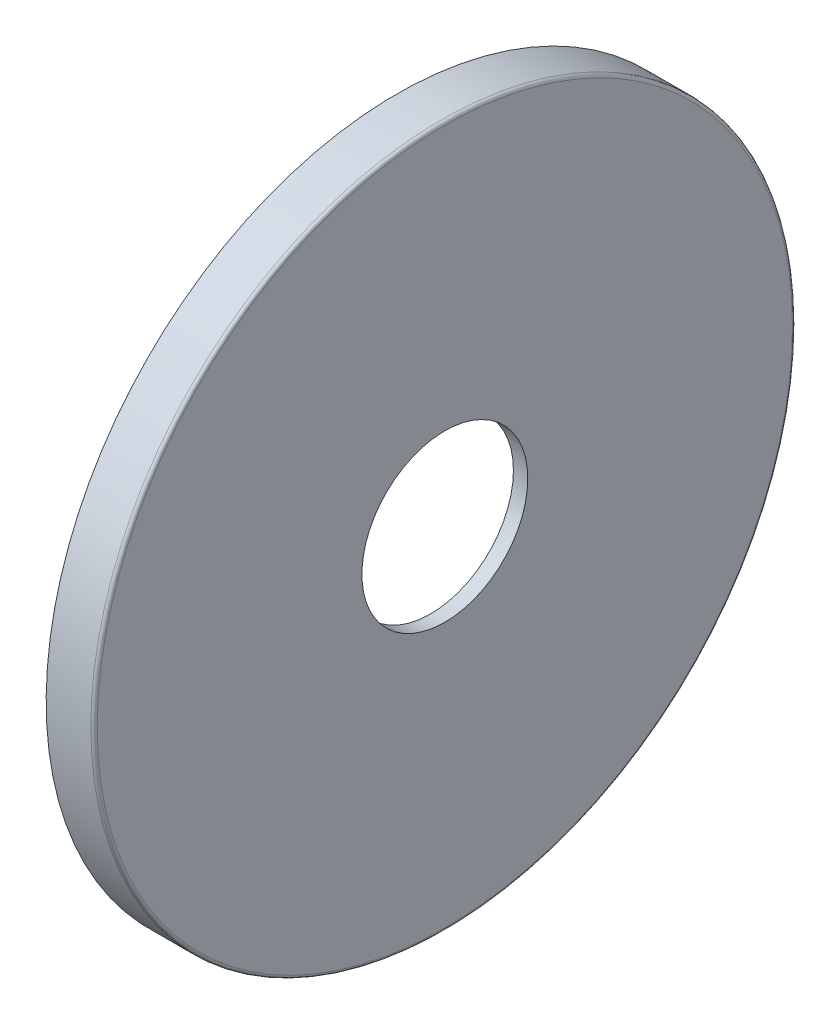
ISO-10303-21;
HEADER;
FILE_DESCRIPTION(('STEP AP214'),'2;1');
FILE_NAME('part.step','',(''),(''),'','','');
FILE_SCHEMA(('AUTOMOTIVE_DESIGN { 1 0 10303 214 1 1 1 1 }'));
ENDSEC;
DATA;
#1=APPLICATION_CONTEXT('core data for automotive mechanical design processes');
#2=APPLICATION_PROTOCOL_DEFINITION('international standard','automotive_design',2000,#1);
#3=PRODUCT_CONTEXT('',#1,'mechanical');
#4=PRODUCT('Part','Part','',(#3));
#5=PRODUCT_RELATED_PRODUCT_CATEGORY('part','',(#4));
#6=PRODUCT_DEFINITION_FORMATION('','',#4);
#7=PRODUCT_DEFINITION_CONTEXT('part definition',#1,'design');
#8=PRODUCT_DEFINITION('design','',#6,#7);
#9=PRODUCT_DEFINITION_SHAPE('','',#8);
#10=(LENGTH_UNIT() NAMED_UNIT(*) SI_UNIT(.MILLI.,.METRE.));
#11=(NAMED_UNIT(*) PLANE_ANGLE_UNIT() SI_UNIT($,.RADIAN.));
#12=(NAMED_UNIT(*) SI_UNIT($,.STERADIAN.) SOLID_ANGLE_UNIT());
#13=UNCERTAINTY_MEASURE_WITH_UNIT(LENGTH_MEASURE(1.E-05),#10,'distance_accuracy_value','');
#14=(GEOMETRIC_REPRESENTATION_CONTEXT(3) GLOBAL_UNCERTAINTY_ASSIGNED_CONTEXT((#13)) GLOBAL_UNIT_ASSIGNED_CONTEXT((#10,
#11,#12)) REPRESENTATION_CONTEXT('',''));
#15=CARTESIAN_POINT('',(0.,0.,0.));
#16=DIRECTION('',(0.,0.,1.));
#17=DIRECTION('',(1.,0.,0.));
#18=AXIS2_PLACEMENT_3D('',#15,#16,#17);
#19=CARTESIAN_POINT('',(67.,-33.3856048886515,-25.));
#20=DIRECTION('',(1.,0.,0.));
#21=DIRECTION('',(0.,0.,-1.));
#22=AXIS2_PLACEMENT_3D('',#19,#20,#21);
#23=PLANE('',#22);
#24=CARTESIAN_POINT('',(67.,0.,0.));
#25=DIRECTION('',(1.,0.,0.));
#26=DIRECTION('',(0.,0.,-1.));
#27=AXIS2_PLACEMENT_3D('',#24,#25,#26);
#28=CIRCLE('',#27,21.1);
#29=CARTESIAN_POINT('',(67.,-21.0049994049036,2.));
#30=VERTEX_POINT('',#29);
#31=CARTESIAN_POINT('',(67.,21.0049994049036,2.00000000000033));
#32=VERTEX_POINT('',#31);
#33=EDGE_CURVE('E221',#30,#32,#28,.F.);
#34=ORIENTED_EDGE('',*,*,#33,.F.);
#35=DIRECTION('',(0.,-1.,0.));
#36=VECTOR('',#35,1.);
#37=CARTESIAN_POINT('',(67.,-21.0049994049036,2.));
#38=LINE('',#37,#36);
#39=CARTESIAN_POINT('',(67.,-20.4049994049036,2.00000000000017));
#40=VERTEX_POINT('',#39);
#41=EDGE_CURVE('E189',#40,#30,#38,.T.);
#42=ORIENTED_EDGE('',*,*,#41,.F.);
#43=CARTESIAN_POINT('',(67.,0.6,0.));
#44=DIRECTION('',(-1.,0.,0.));
#45=DIRECTION('',(0.,0.,1.));
#46=AXIS2_PLACEMENT_3D('',#43,#44,#45);
#47=CIRCLE('',#46,21.1);
#48=CARTESIAN_POINT('',(67.,-20.4049994049036,-2.00000000000004));
#49=VERTEX_POINT('',#48);
#50=EDGE_CURVE('E181',#49,#40,#47,.T.);
#51=ORIENTED_EDGE('',*,*,#50,.F.);
#52=DIRECTION('',(0.,-1.,0.));
#53=VECTOR('',#52,1.);
#54=CARTESIAN_POINT('',(67.,-21.0049994049036,-2.00000000000005));
#55=LINE('',#54,#53);
#56=CARTESIAN_POINT('',(67.,-21.0049994049036,-2.00000000000005));
#57=VERTEX_POINT('',#56);
#58=EDGE_CURVE('E193',#49,#57,#55,.T.);
#59=ORIENTED_EDGE('',*,*,#58,.T.);
#60=CARTESIAN_POINT('',(67.,21.0049994049036,-2.00000000000005));
#61=VERTEX_POINT('',#60);
#62=EDGE_CURVE('E226',#61,#57,#28,.F.);
#63=ORIENTED_EDGE('',*,*,#62,.F.);
#64=DIRECTION('',(0.,1.,0.));
#65=VECTOR('',#64,1.);
#66=CARTESIAN_POINT('',(67.,21.0049994049036,-2.00000000000005));
#67=LINE('',#66,#65);
#68=CARTESIAN_POINT('',(67.,20.4049994049036,-2.00000000000005));
#69=VERTEX_POINT('',#68);
#70=EDGE_CURVE('E200',#69,#61,#67,.T.);
#71=ORIENTED_EDGE('',*,*,#70,.F.);
#72=CARTESIAN_POINT('',(67.,-0.6,0.));
#73=DIRECTION('',(1.,0.,0.));
#74=DIRECTION('',(0.,0.,-1.));
#75=AXIS2_PLACEMENT_3D('',#72,#73,#74);
#76=CIRCLE('',#75,21.1);
#77=CARTESIAN_POINT('',(67.,20.4049994049036,2.00000000000033));
#78=VERTEX_POINT('',#77);
#79=EDGE_CURVE('E196',#69,#78,#76,.T.);
#80=ORIENTED_EDGE('',*,*,#79,.T.);
#81=DIRECTION('',(0.,1.,0.));
#82=VECTOR('',#81,1.);
#83=CARTESIAN_POINT('',(67.,21.0049994049036,2.00000000000033));
#84=LINE('',#83,#82);
#85=EDGE_CURVE('E206',#78,#32,#84,.T.);
#86=ORIENTED_EDGE('',*,*,#85,.T.);
#87=EDGE_LOOP('',(#34,#42,#51,#59,#63,#71,#80,#86));
#88=FACE_BOUND('',#87,.T.);
#89=DIRECTION('',(0.,-1.,0.));
#90=VECTOR('',#89,1.);
#91=CARTESIAN_POINT('',(67.,-21.1246301742776,4.));
#92=LINE('',#91,#90);
#93=CARTESIAN_POINT('',(67.,-21.1246301742776,4.));
#94=VERTEX_POINT('',#93);
#95=CARTESIAN_POINT('',(67.,-21.3915871313935,4.));
#96=VERTEX_POINT('',#95);
#97=EDGE_CURVE('E177',#94,#96,#92,.T.);
#98=ORIENTED_EDGE('',*,*,#97,.T.);
#99=CARTESIAN_POINT('',(67.,-21.3915871313935,4.2));
#100=DIRECTION('',(1.,0.,0.));
#101=DIRECTION('',(0.,0.,-1.));
#102=AXIS2_PLACEMENT_3D('',#99,#100,#101);
#103=CIRCLE('',#102,0.2);
#104=CARTESIAN_POINT('',(67.,-21.5878402243421,4.23853211009174));
#105=VERTEX_POINT('',#104);
#106=EDGE_CURVE('E326',#96,#105,#103,.F.);
#107=ORIENTED_EDGE('',*,*,#106,.T.);
#108=CARTESIAN_POINT('',(67.,0.,0.));
#109=DIRECTION('',(1.,0.,0.));
#110=DIRECTION('',(0.,0.,-1.));
#111=AXIS2_PLACEMENT_3D('',#108,#109,#110);
#112=CIRCLE('',#111,22.);
#113=CARTESIAN_POINT('',(67.,-21.5878402243421,-4.23853211009174));
#114=VERTEX_POINT('',#113);
#115=EDGE_CURVE('E225',#105,#114,#112,.F.);
#116=ORIENTED_EDGE('',*,*,#115,.T.);
#117=CARTESIAN_POINT('',(67.,-21.3915871313935,-4.2));
#118=DIRECTION('',(1.,0.,0.));
#119=DIRECTION('',(0.,0.,-1.));
#120=AXIS2_PLACEMENT_3D('',#117,#118,#119);
#121=CIRCLE('',#120,0.2);
#122=CARTESIAN_POINT('',(67.,-21.3915871313935,-4.));
#123=VERTEX_POINT('',#122);
#124=EDGE_CURVE('E336',#114,#123,#121,.F.);
#125=ORIENTED_EDGE('',*,*,#124,.T.);
#126=DIRECTION('',(0.,1.,0.));
#127=VECTOR('',#126,1.);
#128=CARTESIAN_POINT('',(67.,-23.5456760368751,-4.));
#129=LINE('',#128,#127);
#130=CARTESIAN_POINT('',(67.,-21.1246301742776,-4.));
#131=VERTEX_POINT('',#130);
#132=EDGE_CURVE('E173',#123,#131,#129,.T.);
#133=ORIENTED_EDGE('',*,*,#132,.T.);
#134=CARTESIAN_POINT('',(67.,0.,0.));
#135=DIRECTION('',(-1.,0.,0.));
#136=DIRECTION('',(0.,0.,-1.));
#137=AXIS2_PLACEMENT_3D('',#134,#135,#136);
#138=CIRCLE('',#137,21.5);
#139=EDGE_CURVE('E328',#131,#94,#138,.T.);
#140=ORIENTED_EDGE('',*,*,#139,.T.);
#141=EDGE_LOOP('',(#98,#107,#116,#125,#133,#140));
#142=FACE_BOUND('',#141,.T.);
#143=ADVANCED_FACE('F36',(#88,#142),#23,.F.);
#144=CARTESIAN_POINT('',(-20.,0.,0.));
#145=DIRECTION('',(1.,0.,0.));
#146=DIRECTION('',(0.,0.,-1.));
#147=AXIS2_PLACEMENT_3D('',#144,#145,#146);
#148=CYLINDRICAL_SURFACE('',#147,22.);
#149=CARTESIAN_POINT('',(69.8,0.,0.));
#150=DIRECTION('',(1.,0.,0.));
#151=DIRECTION('',(0.,0.,-1.));
#152=AXIS2_PLACEMENT_3D('',#149,#150,#151);
#153=CIRCLE('',#152,22.);
#154=CARTESIAN_POINT('',(69.8,0.,-22.));
#155=VERTEX_POINT('',#154);
#156=EDGE_CURVE('E234',#155,#155,#153,.F.);
#157=ORIENTED_EDGE('',*,*,#156,.T.);
#158=EDGE_LOOP('',(#157));
#159=FACE_BOUND('',#158,.T.);
#160=ORIENTED_EDGE('',*,*,#115,.F.);
#161=DIRECTION('',(1.,0.,0.));
#162=VECTOR('',#161,1.);
#163=CARTESIAN_POINT('',(-20.,-21.5878402243421,4.23853211009174));
#164=LINE('',#163,#162);
#165=CARTESIAN_POINT('',(67.8,-21.5878402243421,4.23853211009174));
#166=VERTEX_POINT('',#165);
#167=EDGE_CURVE('E335',#105,#166,#164,.T.);
#168=ORIENTED_EDGE('',*,*,#167,.T.);
#169=CARTESIAN_POINT('',(67.8,0.,0.));
#170=DIRECTION('',(1.,0.,0.));
#171=DIRECTION('',(0.,0.,-1.));
#172=AXIS2_PLACEMENT_3D('',#169,#170,#171);
#173=CIRCLE('',#172,22.);
#174=CARTESIAN_POINT('',(67.8,-21.5878402243421,-4.23853211009174));
#175=VERTEX_POINT('',#174);
#176=EDGE_CURVE('E362',#166,#175,#173,.T.);
#177=ORIENTED_EDGE('',*,*,#176,.T.);
#178=DIRECTION('',(1.,0.,0.));
#179=VECTOR('',#178,1.);
#180=CARTESIAN_POINT('',(-20.,-21.5878402243421,-4.23853211009174));
#181=LINE('',#180,#179);
#182=EDGE_CURVE('E295',#175,#114,#181,.F.);
#183=ORIENTED_EDGE('',*,*,#182,.T.);
#184=EDGE_LOOP('',(#160,#168,#177,#183));
#185=FACE_BOUND('',#184,.T.);
#186=ADVANCED_FACE('F310',(#159,#185),#148,.T.);
#187=CARTESIAN_POINT('',(-20.,0.,0.));
#188=DIRECTION('',(1.,0.,0.));
#189=DIRECTION('',(0.,0.,-1.));
#190=AXIS2_PLACEMENT_3D('',#187,#188,#189);
#191=CYLINDRICAL_SURFACE('',#190,21.1);
#192=CARTESIAN_POINT('',(69.1,0.,0.));
#193=DIRECTION('',(1.,0.,0.));
#194=DIRECTION('',(0.,0.,-1.));
#195=AXIS2_PLACEMENT_3D('',#192,#193,#194);
#196=CIRCLE('',#195,21.1);
#197=CARTESIAN_POINT('',(69.1,0.,-21.1));
#198=VERTEX_POINT('',#197);
#199=EDGE_CURVE('E222',#198,#198,#196,.T.);
#200=ORIENTED_EDGE('',*,*,#199,.T.);
#201=EDGE_LOOP('',(#200));
#202=FACE_BOUND('',#201,.T.);
#203=DIRECTION('',(1.,0.,0.));
#204=VECTOR('',#203,1.);
#205=CARTESIAN_POINT('',(-20.,-21.0049994049036,2.00000000000033));
#206=LINE('',#205,#204);
#207=CARTESIAN_POINT('',(67.7413560551055,-21.0049994049036,2.00000000000033));
#208=VERTEX_POINT('',#207);
#209=EDGE_CURVE('E249',#30,#208,#206,.T.);
#210=ORIENTED_EDGE('',*,*,#209,.F.);
#211=ORIENTED_EDGE('',*,*,#33,.T.);
#212=DIRECTION('',(1.,0.,0.));
#213=VECTOR('',#212,1.);
#214=CARTESIAN_POINT('',(-20.,21.0049994049036,2.00000000000033));
#215=LINE('',#214,#213);
#216=CARTESIAN_POINT('',(67.8,21.0049994049036,2.00000000000033));
#217=VERTEX_POINT('',#216);
#218=EDGE_CURVE('E243',#32,#217,#215,.T.);
#219=ORIENTED_EDGE('',*,*,#218,.T.);
#220=CARTESIAN_POINT('',(67.8,0.,0.));
#221=DIRECTION('',(1.,0.,0.));
#222=DIRECTION('',(0.,0.,-1.));
#223=AXIS2_PLACEMENT_3D('',#220,#221,#222);
#224=CIRCLE('',#223,21.1);
#225=CARTESIAN_POINT('',(67.8,21.0049994049036,-2.00000000000005));
#226=VERTEX_POINT('',#225);
#227=EDGE_CURVE('E240',#217,#226,#224,.F.);
#228=ORIENTED_EDGE('',*,*,#227,.T.);
#229=DIRECTION('',(1.,0.,0.));
#230=VECTOR('',#229,1.);
#231=CARTESIAN_POINT('',(-20.,21.0049994049036,-2.00000000000005));
#232=LINE('',#231,#230);
#233=EDGE_CURVE('E237',#61,#226,#232,.T.);
#234=ORIENTED_EDGE('',*,*,#233,.F.);
#235=ORIENTED_EDGE('',*,*,#62,.T.);
#236=DIRECTION('',(1.,0.,0.));
#237=VECTOR('',#236,1.);
#238=CARTESIAN_POINT('',(-20.,-21.0049994049036,-2.00000000000005));
#239=LINE('',#238,#237);
#240=CARTESIAN_POINT('',(67.7413560551055,-21.0049994049036,-2.00000000000005));
#241=VERTEX_POINT('',#240);
#242=EDGE_CURVE('E246',#57,#241,#239,.T.);
#243=ORIENTED_EDGE('',*,*,#242,.T.);
#244=CARTESIAN_POINT('',(67.7413560551055,-21.0049994049036,-2.00000000000005));
#245=CARTESIAN_POINT('',(67.7418567212597,-21.0366840430386,-1.66729499912158));
#246=CARTESIAN_POINT('',(67.7422322748471,-21.0604520184213,-1.33383659012421));
#247=CARTESIAN_POINT('',(67.7427322042752,-21.0920921903696,-0.666917660865427));
#248=CARTESIAN_POINT('',(67.7428571428571,-21.1,-0.333458830432725));
#249=CARTESIAN_POINT('',(67.7428571428571,-21.1,0.333458830432734));
#250=CARTESIAN_POINT('',(67.7427322042752,-21.0920921903696,0.666917660865491));
#251=CARTESIAN_POINT('',(67.7422322748471,-21.0604520184213,1.33383659012439));
#252=CARTESIAN_POINT('',(67.7418567212597,-21.0366840430386,1.66729499912181));
#253=CARTESIAN_POINT('',(67.7413560551055,-21.0049994049036,2.00000000000033));
#254=B_SPLINE_CURVE_WITH_KNOTS('',3,(#244,#245,#246,#247,#248,#249,#250,#251,#252,#253),
.UNSPECIFIED.,.F.,.F.,(4,2,2,2,4),(0.,1.00253668389604,2.00281969925344,3.00310271461101,
4.00563939850722),.UNSPECIFIED.);
#255=EDGE_CURVE('E287',#241,#208,#254,.T.);
#256=ORIENTED_EDGE('',*,*,#255,.T.);
#257=EDGE_LOOP('',(#210,#211,#219,#228,#234,#235,#243,#256));
#258=FACE_BOUND('',#257,.T.);
#259=ADVANCED_FACE('F304',(#202,#258),#191,.F.);
#260=CARTESIAN_POINT('',(70.,0.,0.));
#261=DIRECTION('',(1.,0.,0.));
#262=DIRECTION('',(0.,0.,-1.));
#263=AXIS2_PLACEMENT_3D('',#260,#261,#262);
#264=PLANE('',#263);
#265=CARTESIAN_POINT('',(70.,0.,0.));
#266=DIRECTION('',(1.,0.,0.));
#267=DIRECTION('',(0.,0.,-1.));
#268=AXIS2_PLACEMENT_3D('',#265,#266,#267);
#269=CIRCLE('',#268,5.2);
#270=CARTESIAN_POINT('',(70.,0.,-5.2));
#271=VERTEX_POINT('',#270);
#272=EDGE_CURVE('E213',#271,#271,#269,.T.);
#273=ORIENTED_EDGE('',*,*,#272,.F.);
#274=EDGE_LOOP('',(#273));
#275=FACE_BOUND('',#274,.T.);
#276=CARTESIAN_POINT('',(70.,0.,0.));
#277=DIRECTION('',(1.,0.,0.));
#278=DIRECTION('',(0.,0.,-1.));
#279=AXIS2_PLACEMENT_3D('',#276,#277,#278);
#280=CIRCLE('',#279,21.8);
#281=CARTESIAN_POINT('',(70.,0.,-21.8));
#282=VERTEX_POINT('',#281);
#283=EDGE_CURVE('E231',#282,#282,#280,.T.);
#284=ORIENTED_EDGE('',*,*,#283,.T.);
#285=EDGE_LOOP('',(#284));
#286=FACE_BOUND('',#285,.T.);
#287=ADVANCED_FACE('F309',(#275,#286),#264,.T.);
#288=CARTESIAN_POINT('',(69.8,0.,0.));
#289=DIRECTION('',(1.,0.,0.));
#290=DIRECTION('',(0.,0.,-1.));
#291=AXIS2_PLACEMENT_3D('',#288,#289,#290);
#292=TOROIDAL_SURFACE('',#291,21.8,0.2);
#293=ORIENTED_EDGE('',*,*,#156,.F.);
#294=EDGE_LOOP('',(#293));
#295=FACE_BOUND('',#294,.T.);
#296=ORIENTED_EDGE('',*,*,#283,.F.);
#297=EDGE_LOOP('',(#296));
#298=FACE_BOUND('',#297,.T.);
#299=ADVANCED_FACE('F281',(#295,#298),#292,.T.);
#300=CARTESIAN_POINT('',(69.1,0.,0.));
#301=DIRECTION('',(1.,0.,0.));
#302=DIRECTION('',(0.,0.,-1.));
#303=AXIS2_PLACEMENT_3D('',#300,#301,#302);
#304=PLANE('',#303);
#305=CARTESIAN_POINT('',(69.1,0.,0.));
#306=DIRECTION('',(1.,0.,0.));
#307=DIRECTION('',(0.,0.,-1.));
#308=AXIS2_PLACEMENT_3D('',#305,#306,#307);
#309=CIRCLE('',#308,5.2);
#310=CARTESIAN_POINT('',(69.1,0.,-5.2));
#311=VERTEX_POINT('',#310);
#312=EDGE_CURVE('E218',#311,#311,#309,.F.);
#313=ORIENTED_EDGE('',*,*,#312,.F.);
#314=EDGE_LOOP('',(#313));
#315=FACE_BOUND('',#314,.T.);
#316=ORIENTED_EDGE('',*,*,#199,.F.);
#317=EDGE_LOOP('',(#316));
#318=FACE_BOUND('',#317,.T.);
#319=ADVANCED_FACE('F312',(#315,#318),#304,.F.);
#320=CARTESIAN_POINT('',(-20.001,0.,0.));
#321=DIRECTION('',(1.,0.,0.));
#322=DIRECTION('',(0.,0.,-1.));
#323=AXIS2_PLACEMENT_3D('',#320,#321,#322);
#324=CYLINDRICAL_SURFACE('',#323,5.2);
#325=CARTESIAN_POINT('',(70.,0.,-5.2));
#326=CARTESIAN_POINT('',(69.990625,0.,-5.2));
#327=CARTESIAN_POINT('',(69.98125,0.,-5.2));
#328=CARTESIAN_POINT('',(69.9625,0.,-5.2));
#329=CARTESIAN_POINT('',(69.953125,0.,-5.2));
#330=CARTESIAN_POINT('',(69.934375,0.,-5.2));
#331=CARTESIAN_POINT('',(69.925,0.,-5.2));
#332=CARTESIAN_POINT('',(69.90625,0.,-5.2));
#333=CARTESIAN_POINT('',(69.896875,0.,-5.2));
#334=CARTESIAN_POINT('',(69.878125,0.,-5.2));
#335=CARTESIAN_POINT('',(69.86875,0.,-5.2));
#336=CARTESIAN_POINT('',(69.85,0.,-5.2));
#337=CARTESIAN_POINT('',(69.840625,0.,-5.2));
#338=CARTESIAN_POINT('',(69.821875,0.,-5.2));
#339=CARTESIAN_POINT('',(69.8125,0.,-5.2));
#340=CARTESIAN_POINT('',(69.79375,0.,-5.2));
#341=CARTESIAN_POINT('',(69.784375,0.,-5.2));
#342=CARTESIAN_POINT('',(69.765625,0.,-5.2));
#343=CARTESIAN_POINT('',(69.75625,0.,-5.2));
#344=CARTESIAN_POINT('',(69.7375,0.,-5.2));
#345=CARTESIAN_POINT('',(69.728125,0.,-5.2));
#346=CARTESIAN_POINT('',(69.709375,0.,-5.2));
#347=CARTESIAN_POINT('',(69.7,0.,-5.2));
#348=CARTESIAN_POINT('',(69.68125,0.,-5.2));
#349=CARTESIAN_POINT('',(69.671875,0.,-5.2));
#350=CARTESIAN_POINT('',(69.653125,0.,-5.2));
#351=CARTESIAN_POINT('',(69.64375,0.,-5.2));
#352=CARTESIAN_POINT('',(69.625,0.,-5.2));
#353=CARTESIAN_POINT('',(69.615625,0.,-5.2));
#354=CARTESIAN_POINT('',(69.596875,0.,-5.2));
#355=CARTESIAN_POINT('',(69.5875,0.,-5.2));
#356=CARTESIAN_POINT('',(69.56875,0.,-5.2));
#357=CARTESIAN_POINT('',(69.559375,0.,-5.2));
#358=CARTESIAN_POINT('',(69.540625,0.,-5.2));
#359=CARTESIAN_POINT('',(69.53125,0.,-5.2));
#360=CARTESIAN_POINT('',(69.5125,0.,-5.2));
#361=CARTESIAN_POINT('',(69.503125,0.,-5.2));
#362=CARTESIAN_POINT('',(69.484375,0.,-5.2));
#363=CARTESIAN_POINT('',(69.475,0.,-5.2));
#364=CARTESIAN_POINT('',(69.45625,0.,-5.2));
#365=CARTESIAN_POINT('',(69.446875,0.,-5.2));
#366=CARTESIAN_POINT('',(69.428125,0.,-5.2));
#367=CARTESIAN_POINT('',(69.41875,0.,-5.2));
#368=CARTESIAN_POINT('',(69.4,0.,-5.2));
#369=CARTESIAN_POINT('',(69.390625,0.,-5.2));
#370=CARTESIAN_POINT('',(69.371875,0.,-5.2));
#371=CARTESIAN_POINT('',(69.3625,0.,-5.2));
#372=CARTESIAN_POINT('',(69.34375,0.,-5.2));
#373=CARTESIAN_POINT('',(69.334375,0.,-5.2));
#374=CARTESIAN_POINT('',(69.315625,0.,-5.2));
#375=CARTESIAN_POINT('',(69.30625,0.,-5.2));
#376=CARTESIAN_POINT('',(69.2875,0.,-5.2));
#377=CARTESIAN_POINT('',(69.278125,0.,-5.2));
#378=CARTESIAN_POINT('',(69.259375,0.,-5.2));
#379=CARTESIAN_POINT('',(69.25,0.,-5.2));
#380=CARTESIAN_POINT('',(69.23125,0.,-5.2));
#381=CARTESIAN_POINT('',(69.221875,0.,-5.2));
#382=CARTESIAN_POINT('',(69.203125,0.,-5.2));
#383=CARTESIAN_POINT('',(69.19375,0.,-5.2));
#384=CARTESIAN_POINT('',(69.175,0.,-5.2));
#385=CARTESIAN_POINT('',(69.165625,0.,-5.2));
#386=CARTESIAN_POINT('',(69.146875,0.,-5.2));
#387=CARTESIAN_POINT('',(69.1375,0.,-5.2));
#388=CARTESIAN_POINT('',(69.11875,0.,-5.2));
#389=CARTESIAN_POINT('',(69.109375,0.,-5.2));
#390=CARTESIAN_POINT('',(69.1,0.,-5.2));
#391=B_SPLINE_CURVE_WITH_KNOTS('',3,(#325,#326,#327,#328,#329,#330,#331,#332,#333,#334,#335,
#336,#337,#338,#339,#340,#341,#342,#343,#344,#345,#346,#347,#348,#349,#350,#351,#352,#353,#354,
#355,#356,#357,#358,#359,#360,#361,#362,#363,#364,#365,#366,#367,#368,#369,#370,#371,#372,#373,
#374,#375,#376,#377,#378,#379,#380,#381,#382,#383,#384,#385,#386,#387,#388,#389,#390),
.UNSPECIFIED.,.F.,.F.,(4,2,2,2,2,2,2,2,2,2,2,2,2,2,2,2,2,2,2,2,2,2,2,2,2,2,2,2,2,2,2,2,4),(0.,
0.0281250000000038,0.0562500000000077,0.0843749999999976,0.112500000000001,0.140625000000005,
0.168749999999995,0.196874999999999,0.225000000000003,0.253125000000007,0.281250000000011,
0.309375000000001,0.337500000000004,0.365625000000008,0.393749999999998,0.421875000000002,
0.450000000000006,0.47812500000001,0.506250000000014,0.534375000000004,0.562500000000007,
0.590625000000011,0.618750000000001,0.646875000000005,0.675000000000009,0.703125000000013,
0.731250000000017,0.759375000000007,0.78750000000001,0.815625000000014,0.843750000000004,
0.871875000000008,0.900000000000012),.UNSPECIFIED.);
#392=EDGE_CURVE('BSEAM424',#271,#311,#391,.T.);
#393=ORIENTED_EDGE('',*,*,#272,.T.);
#394=ORIENTED_EDGE('',*,*,#312,.T.);
#395=ORIENTED_EDGE('',*,*,#392,.T.);
#396=ORIENTED_EDGE('',*,*,#392,.F.);
#397=EDGE_LOOP('',(#393,#395,#394,#396));
#398=FACE_BOUND('',#397,.T.);
#399=ADVANCED_FACE('F424',(#398),#324,.F.);
#400=CARTESIAN_POINT('',(-20.,21.0049994049036,2.00000000000033));
#401=DIRECTION('',(0.,0.,1.));
#402=DIRECTION('',(1.,0.,0.));
#403=AXIS2_PLACEMENT_3D('',#400,#401,#402);
#404=PLANE('',#403);
#405=DIRECTION('',(1.,0.,0.));
#406=VECTOR('',#405,1.);
#407=CARTESIAN_POINT('',(-20.,20.4049994049036,2.00000000000033));
#408=LINE('',#407,#406);
#409=CARTESIAN_POINT('',(67.1,20.4049994049036,2.00000000000033));
#410=VERTEX_POINT('',#409);
#411=EDGE_CURVE('E201',#78,#410,#408,.T.);
#412=ORIENTED_EDGE('',*,*,#411,.T.);
#413=CARTESIAN_POINT('',(67.1,20.4049994049036,2.00000000000033));
#414=CARTESIAN_POINT('',(67.2166642518409,20.4719661494614,2.00000000000033));
#415=CARTESIAN_POINT('',(67.3333297110948,20.5389307903824,2.00000000000033));
#416=CARTESIAN_POINT('',(67.5666630444281,20.6728558649505,2.00000000000033));
#417=CARTESIAN_POINT('',(67.6833309185075,20.7398162985974,2.00000000000033));
#418=CARTESIAN_POINT('',(67.8,20.8067746286076,2.00000000000033));
#419=B_SPLINE_CURVE_WITH_KNOTS('',3,(#413,#414,#415,#416,#417,#418),.UNSPECIFIED.,.F.,.F.,(4,2,
4),(0.,0.403554002147862,0.807108004293259),.UNSPECIFIED.);
#420=CARTESIAN_POINT('',(67.8,20.8067746286076,2.00000000000033));
#421=VERTEX_POINT('',#420);
#422=EDGE_CURVE('E296',#410,#421,#419,.T.);
#423=ORIENTED_EDGE('',*,*,#422,.T.);
#424=DIRECTION('',(0.,1.,0.));
#425=VECTOR('',#424,1.);
#426=CARTESIAN_POINT('',(67.8,21.0049994049036,2.00000000000033));
#427=LINE('',#426,#425);
#428=EDGE_CURVE('E209',#421,#217,#427,.T.);
#429=ORIENTED_EDGE('',*,*,#428,.T.);
#430=ORIENTED_EDGE('',*,*,#218,.F.);
#431=ORIENTED_EDGE('',*,*,#85,.F.);
#432=EDGE_LOOP('',(#412,#423,#429,#430,#431));
#433=FACE_BOUND('',#432,.T.);
#434=ADVANCED_FACE('F426',(#433),#404,.T.);
#435=CARTESIAN_POINT('',(67.8,21.0049994049036,-2.00000000000005));
#436=DIRECTION('',(1.,0.,0.));
#437=DIRECTION('',(0.,0.,-1.));
#438=AXIS2_PLACEMENT_3D('',#435,#436,#437);
#439=PLANE('',#438);
#440=ORIENTED_EDGE('',*,*,#428,.F.);
#441=CARTESIAN_POINT('',(67.8,-0.6,0.));
#442=DIRECTION('',(1.,0.,0.));
#443=DIRECTION('',(0.,0.,-1.));
#444=AXIS2_PLACEMENT_3D('',#441,#442,#443);
#445=CIRCLE('',#444,21.5);
#446=CARTESIAN_POINT('',(67.8,20.8067746286076,-2.00000000000005));
#447=VERTEX_POINT('',#446);
#448=EDGE_CURVE('E405',#421,#447,#445,.F.);
#449=ORIENTED_EDGE('',*,*,#448,.T.);
#450=DIRECTION('',(0.,1.,0.));
#451=VECTOR('',#450,1.);
#452=CARTESIAN_POINT('',(67.8,21.0049994049036,-2.00000000000005));
#453=LINE('',#452,#451);
#454=EDGE_CURVE('E211',#447,#226,#453,.T.);
#455=ORIENTED_EDGE('',*,*,#454,.T.);
#456=ORIENTED_EDGE('',*,*,#227,.F.);
#457=EDGE_LOOP('',(#440,#449,#455,#456));
#458=FACE_BOUND('',#457,.T.);
#459=ADVANCED_FACE('F422',(#458),#439,.T.);
#460=CARTESIAN_POINT('',(-20.,21.0049994049036,-2.00000000000005));
#461=DIRECTION('',(0.,0.,1.));
#462=DIRECTION('',(1.,0.,0.));
#463=AXIS2_PLACEMENT_3D('',#460,#461,#462);
#464=PLANE('',#463);
#465=ORIENTED_EDGE('',*,*,#454,.F.);
#466=CARTESIAN_POINT('',(67.8,20.8067746286076,-2.00000000000005));
#467=CARTESIAN_POINT('',(67.6833309185075,20.7398162985975,-2.00000000000005));
#468=CARTESIAN_POINT('',(67.5666630444281,20.6728558649505,-2.00000000000005));
#469=CARTESIAN_POINT('',(67.3333297110948,20.5389307903825,-2.00000000000005));
#470=CARTESIAN_POINT('',(67.2166642518409,20.4719661494614,-2.00000000000005));
#471=CARTESIAN_POINT('',(67.1,20.4049994049036,-2.00000000000005));
#472=B_SPLINE_CURVE_WITH_KNOTS('',3,(#466,#467,#468,#469,#470,#471),.UNSPECIFIED.,.F.,.F.,(4,2,
4),(0.,0.403554002145397,0.807108004293258),.UNSPECIFIED.);
#473=CARTESIAN_POINT('',(67.1,20.4049994049036,-2.00000000000005));
#474=VERTEX_POINT('',#473);
#475=EDGE_CURVE('E407',#447,#474,#472,.T.);
#476=ORIENTED_EDGE('',*,*,#475,.T.);
#477=DIRECTION('',(1.,0.,0.));
#478=VECTOR('',#477,1.);
#479=CARTESIAN_POINT('',(-20.,20.4049994049036,-2.00000000000005));
#480=LINE('',#479,#478);
#481=EDGE_CURVE('E197',#69,#474,#480,.T.);
#482=ORIENTED_EDGE('',*,*,#481,.F.);
#483=ORIENTED_EDGE('',*,*,#70,.T.);
#484=ORIENTED_EDGE('',*,*,#233,.T.);
#485=EDGE_LOOP('',(#465,#476,#482,#483,#484));
#486=FACE_BOUND('',#485,.T.);
#487=ADVANCED_FACE('F397',(#486),#464,.F.);
#488=CARTESIAN_POINT('',(-20.,-0.6,0.));
#489=DIRECTION('',(1.,0.,0.));
#490=DIRECTION('',(0.,0.,-1.));
#491=AXIS2_PLACEMENT_3D('',#488,#489,#490);
#492=CYLINDRICAL_SURFACE('',#491,21.1);
#493=ORIENTED_EDGE('',*,*,#481,.T.);
#494=CARTESIAN_POINT('',(67.1,-0.6,0.));
#495=DIRECTION('',(1.,0.,0.));
#496=DIRECTION('',(0.,0.,-1.));
#497=AXIS2_PLACEMENT_3D('',#494,#495,#496);
#498=CIRCLE('',#497,21.1);
#499=EDGE_CURVE('E412',#474,#410,#498,.T.);
#500=ORIENTED_EDGE('',*,*,#499,.T.);
#501=ORIENTED_EDGE('',*,*,#411,.F.);
#502=ORIENTED_EDGE('',*,*,#79,.F.);
#503=EDGE_LOOP('',(#493,#500,#501,#502));
#504=FACE_BOUND('',#503,.T.);
#505=ADVANCED_FACE('F390',(#504),#492,.F.);
#506=CARTESIAN_POINT('',(-20.,-21.0049994049036,2.00000000000033));
#507=DIRECTION('',(0.,0.,-1.));
#508=DIRECTION('',(-1.,0.,0.));
#509=AXIS2_PLACEMENT_3D('',#506,#507,#508);
#510=PLANE('',#509);
#511=ORIENTED_EDGE('',*,*,#209,.T.);
#512=CARTESIAN_POINT('',(67.7413560551055,-21.0049994049036,2.00000000000033));
#513=CARTESIAN_POINT('',(67.6844580913328,-20.9050024133451,2.00000000000033));
#514=CARTESIAN_POINT('',(67.6275627715212,-20.8050039175663,2.00000000000033));
#515=CARTESIAN_POINT('',(67.5137774198194,-20.6050039175663,2.00000000000033));
#516=CARTESIAN_POINT('',(67.4568873879291,-20.5050024133451,2.00000000000033));
#517=CARTESIAN_POINT('',(67.4,-20.4049994049036,2.00000000000033));
#518=B_SPLINE_CURVE_WITH_KNOTS('',3,(#512,#513,#514,#515,#516,#517),.UNSPECIFIED.,.F.,.F.,(4,2,
4),(0.,0.345153573312306,0.690307146631344),.UNSPECIFIED.);
#519=CARTESIAN_POINT('',(67.4,-20.4049994049036,2.00000000000033));
#520=VERTEX_POINT('',#519);
#521=EDGE_CURVE('E263',#208,#520,#518,.T.);
#522=ORIENTED_EDGE('',*,*,#521,.T.);
#523=DIRECTION('',(1.,0.,0.));
#524=VECTOR('',#523,1.);
#525=CARTESIAN_POINT('',(-20.,-20.4049994049036,2.00000000000033));
#526=LINE('',#525,#524);
#527=EDGE_CURVE('E178',#40,#520,#526,.T.);
#528=ORIENTED_EDGE('',*,*,#527,.F.);
#529=ORIENTED_EDGE('',*,*,#41,.T.);
#530=EDGE_LOOP('',(#511,#522,#528,#529));
#531=FACE_BOUND('',#530,.T.);
#532=ADVANCED_FACE('F387',(#531),#510,.F.);
#533=CARTESIAN_POINT('',(-20.,-21.0049994049036,-2.00000000000005));
#534=DIRECTION('',(0.,0.,-1.));
#535=DIRECTION('',(-1.,0.,0.));
#536=AXIS2_PLACEMENT_3D('',#533,#534,#535);
#537=PLANE('',#536);
#538=DIRECTION('',(1.,0.,0.));
#539=VECTOR('',#538,1.);
#540=CARTESIAN_POINT('',(-20.,-20.4049994049036,-2.00000000000005));
#541=LINE('',#540,#539);
#542=CARTESIAN_POINT('',(67.4,-20.4049994049036,-2.00000000000005));
#543=VERTEX_POINT('',#542);
#544=EDGE_CURVE('E186',#49,#543,#541,.T.);
#545=ORIENTED_EDGE('',*,*,#544,.T.);
#546=CARTESIAN_POINT('',(67.4,-20.4049994049036,-2.00000000000005));
#547=CARTESIAN_POINT('',(67.4568873879291,-20.5050024133451,-2.00000000000005));
#548=CARTESIAN_POINT('',(67.5137774198194,-20.6050039175663,-2.00000000000005));
#549=CARTESIAN_POINT('',(67.6275627715212,-20.8050039175663,-2.00000000000005));
#550=CARTESIAN_POINT('',(67.6844580913328,-20.9050024133451,-2.00000000000005));
#551=CARTESIAN_POINT('',(67.7413560551055,-21.0049994049036,-2.00000000000005));
#552=B_SPLINE_CURVE_WITH_KNOTS('',3,(#546,#547,#548,#549,#550,#551),.UNSPECIFIED.,.F.,.F.,(4,2,
4),(0.,0.34515357331904,0.69030714663135),.UNSPECIFIED.);
#553=EDGE_CURVE('E255',#543,#241,#552,.T.);
#554=ORIENTED_EDGE('',*,*,#553,.T.);
#555=ORIENTED_EDGE('',*,*,#242,.F.);
#556=ORIENTED_EDGE('',*,*,#58,.F.);
#557=EDGE_LOOP('',(#545,#554,#555,#556));
#558=FACE_BOUND('',#557,.T.);
#559=ADVANCED_FACE('F270',(#558),#537,.T.);
#560=CARTESIAN_POINT('',(-20.,0.6,0.));
#561=DIRECTION('',(1.,0.,0.));
#562=DIRECTION('',(0.,0.,-1.));
#563=AXIS2_PLACEMENT_3D('',#560,#561,#562);
#564=CYLINDRICAL_SURFACE('',#563,21.1);
#565=ORIENTED_EDGE('',*,*,#527,.T.);
#566=CARTESIAN_POINT('',(67.4,0.6,0.));
#567=DIRECTION('',(-1.,0.,0.));
#568=DIRECTION('',(0.,0.,1.));
#569=AXIS2_PLACEMENT_3D('',#566,#567,#568);
#570=CIRCLE('',#569,21.1);
#571=EDGE_CURVE('E252',#520,#543,#570,.F.);
#572=ORIENTED_EDGE('',*,*,#571,.T.);
#573=ORIENTED_EDGE('',*,*,#544,.F.);
#574=ORIENTED_EDGE('',*,*,#50,.T.);
#575=EDGE_LOOP('',(#565,#572,#573,#574));
#576=FACE_BOUND('',#575,.T.);
#577=ADVANCED_FACE('F279',(#576),#564,.F.);
#578=CARTESIAN_POINT('',(67.4,0.6,0.));
#579=DIRECTION('',(1.,0.,0.));
#580=DIRECTION('',(0.,0.,-1.));
#581=AXIS2_PLACEMENT_3D('',#578,#579,#580);
#582=CONICAL_SURFACE('',#581,21.1,1.05165021254836);
#583=ORIENTED_EDGE('',*,*,#521,.F.);
#584=ORIENTED_EDGE('',*,*,#255,.F.);
#585=ORIENTED_EDGE('',*,*,#553,.F.);
#586=ORIENTED_EDGE('',*,*,#571,.F.);
#587=EDGE_LOOP('',(#583,#584,#585,#586));
#588=FACE_BOUND('',#587,.T.);
#589=ADVANCED_FACE('F273',(#588),#582,.F.);
#590=CARTESIAN_POINT('',(67.8,-0.6,0.));
#591=DIRECTION('',(1.,0.,0.));
#592=DIRECTION('',(0.,0.,-1.));
#593=AXIS2_PLACEMENT_3D('',#590,#591,#592);
#594=CONICAL_SURFACE('',#593,21.5,0.519146114246517);
#595=ORIENTED_EDGE('',*,*,#422,.F.);
#596=ORIENTED_EDGE('',*,*,#499,.F.);
#597=ORIENTED_EDGE('',*,*,#475,.F.);
#598=ORIENTED_EDGE('',*,*,#448,.F.);
#599=EDGE_LOOP('',(#595,#596,#597,#598));
#600=FACE_BOUND('',#599,.T.);
#601=ADVANCED_FACE('F278',(#600),#594,.F.);
#602=CARTESIAN_POINT('',(67.6,0.,0.));
#603=DIRECTION('',(-1.,0.,0.));
#604=DIRECTION('',(0.,0.,1.));
#605=AXIS2_PLACEMENT_3D('',#602,#603,#604);
#606=CYLINDRICAL_SURFACE('',#605,21.5);
#607=ORIENTED_EDGE('',*,*,#139,.F.);
#608=DIRECTION('',(-1.,0.,0.));
#609=VECTOR('',#608,1.);
#610=CARTESIAN_POINT('',(67.6,-21.1246301742776,-4.));
#611=LINE('',#610,#609);
#612=CARTESIAN_POINT('',(67.6,-21.1246301742776,-4.));
#613=VERTEX_POINT('',#612);
#614=EDGE_CURVE('E172',#613,#131,#611,.T.);
#615=ORIENTED_EDGE('',*,*,#614,.F.);
#616=CARTESIAN_POINT('',(67.6,0.,0.));
#617=DIRECTION('',(-1.,0.,0.));
#618=DIRECTION('',(0.,0.,-1.));
#619=AXIS2_PLACEMENT_3D('',#616,#617,#618);
#620=CIRCLE('',#619,21.5);
#621=CARTESIAN_POINT('',(67.6,-21.1246301742776,4.));
#622=VERTEX_POINT('',#621);
#623=EDGE_CURVE('E157',#613,#622,#620,.T.);
#624=ORIENTED_EDGE('',*,*,#623,.T.);
#625=DIRECTION('',(-1.,0.,0.));
#626=VECTOR('',#625,1.);
#627=CARTESIAN_POINT('',(67.6,-21.1246301742776,4.));
#628=LINE('',#627,#626);
#629=EDGE_CURVE('E169',#622,#94,#628,.T.);
#630=ORIENTED_EDGE('',*,*,#629,.T.);
#631=EDGE_LOOP('',(#607,#615,#624,#630));
#632=FACE_BOUND('',#631,.T.);
#633=ADVANCED_FACE('F168',(#632),#606,.T.);
#634=CARTESIAN_POINT('',(67.6,-21.1246301742776,4.));
#635=DIRECTION('',(0.,0.,-1.));
#636=DIRECTION('',(-1.,0.,0.));
#637=AXIS2_PLACEMENT_3D('',#634,#635,#636);
#638=PLANE('',#637);
#639=DIRECTION('',(0.,-1.,0.));
#640=VECTOR('',#639,1.);
#641=CARTESIAN_POINT('',(67.6,-21.1246301742776,4.));
#642=LINE('',#641,#640);
#643=CARTESIAN_POINT('',(67.6,-21.3915871313935,4.));
#644=VERTEX_POINT('',#643);
#645=EDGE_CURVE('E153',#622,#644,#642,.T.);
#646=ORIENTED_EDGE('',*,*,#645,.T.);
#647=DIRECTION('',(1.,0.,0.));
#648=VECTOR('',#647,1.);
#649=CARTESIAN_POINT('',(67.6,-21.3915871313935,4.));
#650=LINE('',#649,#648);
#651=EDGE_CURVE('E333',#644,#96,#650,.F.);
#652=ORIENTED_EDGE('',*,*,#651,.T.);
#653=ORIENTED_EDGE('',*,*,#97,.F.);
#654=ORIENTED_EDGE('',*,*,#629,.F.);
#655=EDGE_LOOP('',(#646,#652,#653,#654));
#656=FACE_BOUND('',#655,.T.);
#657=ADVANCED_FACE('F175',(#656),#638,.T.);
#658=CARTESIAN_POINT('',(67.6,-23.5456760368751,-4.));
#659=DIRECTION('',(0.,0.,1.));
#660=DIRECTION('',(1.,0.,0.));
#661=AXIS2_PLACEMENT_3D('',#658,#659,#660);
#662=PLANE('',#661);
#663=ORIENTED_EDGE('',*,*,#132,.F.);
#664=DIRECTION('',(1.,0.,0.));
#665=VECTOR('',#664,1.);
#666=CARTESIAN_POINT('',(67.6,-21.3915871313935,-4.));
#667=LINE('',#666,#665);
#668=CARTESIAN_POINT('',(67.6,-21.3915871313935,-4.));
#669=VERTEX_POINT('',#668);
#670=EDGE_CURVE('E338',#123,#669,#667,.T.);
#671=ORIENTED_EDGE('',*,*,#670,.T.);
#672=DIRECTION('',(0.,1.,0.));
#673=VECTOR('',#672,1.);
#674=CARTESIAN_POINT('',(67.6,-23.5456760368751,-4.));
#675=LINE('',#674,#673);
#676=EDGE_CURVE('E162',#669,#613,#675,.T.);
#677=ORIENTED_EDGE('',*,*,#676,.T.);
#678=ORIENTED_EDGE('',*,*,#614,.T.);
#679=EDGE_LOOP('',(#663,#671,#677,#678));
#680=FACE_BOUND('',#679,.T.);
#681=ADVANCED_FACE('F371',(#680),#662,.T.);
#682=CARTESIAN_POINT('',(67.6,0.,0.));
#683=DIRECTION('',(1.,0.,0.));
#684=DIRECTION('',(0.,0.,-1.));
#685=AXIS2_PLACEMENT_3D('',#682,#683,#684);
#686=PLANE('',#685);
#687=ORIENTED_EDGE('',*,*,#676,.F.);
#688=CARTESIAN_POINT('',(67.6,-21.3915871313935,-4.2));
#689=DIRECTION('',(1.,0.,0.));
#690=DIRECTION('',(0.,0.,-1.));
#691=AXIS2_PLACEMENT_3D('',#688,#689,#690);
#692=CIRCLE('',#691,0.2);
#693=CARTESIAN_POINT('',(67.6,-21.4292185925412,-4.00357221904226));
#694=VERTEX_POINT('',#693);
#695=EDGE_CURVE('E11',#669,#694,#692,.T.);
#696=ORIENTED_EDGE('',*,*,#695,.T.);
#697=CARTESIAN_POINT('',(67.6,0.,0.));
#698=DIRECTION('',(1.,0.,0.));
#699=DIRECTION('',(0.,0.,-1.));
#700=AXIS2_PLACEMENT_3D('',#697,#698,#699);
#701=CIRCLE('',#700,21.8);
#702=CARTESIAN_POINT('',(67.6,-21.4292185925412,4.00357221904226));
#703=VERTEX_POINT('',#702);
#704=EDGE_CURVE('E59',#694,#703,#701,.F.);
#705=ORIENTED_EDGE('',*,*,#704,.T.);
#706=CARTESIAN_POINT('',(67.6,-21.3915871313935,4.2));
#707=DIRECTION('',(1.,0.,0.));
#708=DIRECTION('',(0.,0.,-1.));
#709=AXIS2_PLACEMENT_3D('',#706,#707,#708);
#710=CIRCLE('',#709,0.2);
#711=EDGE_CURVE('E51',#703,#644,#710,.T.);
#712=ORIENTED_EDGE('',*,*,#711,.T.);
#713=ORIENTED_EDGE('',*,*,#645,.F.);
#714=ORIENTED_EDGE('',*,*,#623,.F.);
#715=EDGE_LOOP('',(#687,#696,#705,#712,#713,#714));
#716=FACE_BOUND('',#715,.T.);
#717=ADVANCED_FACE('F156',(#716),#686,.F.);
#718=CARTESIAN_POINT('',(-20.,-21.3915871313935,-4.2));
#719=DIRECTION('',(1.,0.,0.));
#720=DIRECTION('',(0.,0.,-1.));
#721=AXIS2_PLACEMENT_3D('',#718,#719,#720);
#722=CYLINDRICAL_SURFACE('',#721,0.2);
#723=ORIENTED_EDGE('',*,*,#124,.F.);
#724=ORIENTED_EDGE('',*,*,#182,.F.);
#725=CARTESIAN_POINT('',(67.6,-21.4292185925412,-4.00357221904226));
#726=CARTESIAN_POINT('',(67.5999849604246,-21.43804909441,-4.0052485511769));
#727=CARTESIAN_POINT('',(67.6006048409607,-21.4467374050669,-4.00754429350094));
#728=CARTESIAN_POINT('',(67.6029804472284,-21.4635229287481,-4.01318118062414));
#729=CARTESIAN_POINT('',(67.6047262477458,-21.4716246253385,-4.01651306002456));
#730=CARTESIAN_POINT('',(67.6092175486385,-21.4870703426325,-4.02405338664031));
#731=CARTESIAN_POINT('',(67.6119602580254,-21.4944164058831,-4.02825937272754));
#732=CARTESIAN_POINT('',(67.6182773435516,-21.5082875789795,-4.03736553605578));
#733=CARTESIAN_POINT('',(67.6218535997467,-21.5148107808315,-4.04226727263376));
#734=CARTESIAN_POINT('',(67.6312678830298,-21.529472239145,-4.05469339507012));
#735=CARTESIAN_POINT('',(67.6374335238511,-21.5371842894605,-4.06247213013816));
#736=CARTESIAN_POINT('',(67.6507024211789,-21.5509398861982,-4.0786735630447));
#737=CARTESIAN_POINT('',(67.6578074420355,-21.5569802250793,-4.08709745978441));
#738=CARTESIAN_POINT('',(67.6755148882654,-21.5695188051891,-4.10761492125103));
#739=CARTESIAN_POINT('',(67.6864164255216,-21.575310311734,-4.11988090205501));
#740=CARTESIAN_POINT('',(67.708968924102,-21.5842344019508,-4.14467433315149));
#741=CARTESIAN_POINT('',(67.7206207385273,-21.5873638992423,-4.15720206974092));
#742=CARTESIAN_POINT('',(67.7431862922131,-21.5910098317693,-4.18100057053843));
#743=CARTESIAN_POINT('',(67.7540617166591,-21.5917506518871,-4.19227517460246));
#744=CARTESIAN_POINT('',(67.7759587017705,-21.5913643205839,-4.21461174068904));
#745=CARTESIAN_POINT('',(67.7869799225752,-21.5902409422812,-4.22567408649791));
#746=CARTESIAN_POINT('',(67.7986636534918,-21.5880955441017,-4.23721414615409));
#747=CARTESIAN_POINT('',(67.7993318472321,-21.587969535405,-4.23787347328819));
#748=CARTESIAN_POINT('',(67.8,-21.5878402243421,-4.23853211009174));
#749=B_SPLINE_CURVE_WITH_KNOTS('',3,(#725,#726,#727,#728,#729,#730,#731,#732,#733,#734,#735,
#736,#737,#738,#739,#740,#741,#742,#743,#744,#745,#746,#747,#748),.UNSPECIFIED.,.F.,.F.,(4,2,2,
2,2,2,2,2,2,2,2,4),(0.,0.026885335426884,0.0535368518535838,0.0801143211473519,
0.106752325866851,0.144253391359487,0.181825919661801,0.23375316894331,0.285740541846326,
0.332675721296526,0.379516020245966,0.382357410271285),.UNSPECIFIED.);
#750=EDGE_CURVE('E41',#694,#175,#749,.T.);
#751=ORIENTED_EDGE('',*,*,#750,.F.);
#752=ORIENTED_EDGE('',*,*,#695,.F.);
#753=ORIENTED_EDGE('',*,*,#670,.F.);
#754=EDGE_LOOP('',(#723,#724,#751,#752,#753));
#755=FACE_BOUND('',#754,.T.);
#756=ADVANCED_FACE('F38',(#755),#722,.T.);
#757=CARTESIAN_POINT('',(67.8,0.,0.));
#758=DIRECTION('',(1.,0.,0.));
#759=DIRECTION('',(0.,0.,-1.));
#760=AXIS2_PLACEMENT_3D('',#757,#758,#759);
#761=TOROIDAL_SURFACE('',#760,21.8,0.2);
#762=ORIENTED_EDGE('',*,*,#750,.T.);
#763=ORIENTED_EDGE('',*,*,#176,.F.);
#764=CARTESIAN_POINT('',(67.6,-21.4292185925412,4.00357221904226));
#765=CARTESIAN_POINT('',(67.5999849604246,-21.43804909441,4.0052485511769));
#766=CARTESIAN_POINT('',(67.6006048409607,-21.4467374050669,4.00754429350094));
#767=CARTESIAN_POINT('',(67.6029804472284,-21.4635229287481,4.01318118062414));
#768=CARTESIAN_POINT('',(67.6047262477458,-21.4716246253385,4.01651306002456));
#769=CARTESIAN_POINT('',(67.6092175486385,-21.4870703426325,4.02405338664031));
#770=CARTESIAN_POINT('',(67.6119602580254,-21.4944164058831,4.02825937272754));
#771=CARTESIAN_POINT('',(67.6182773435516,-21.5082875789795,4.03736553605578));
#772=CARTESIAN_POINT('',(67.6218535997467,-21.5148107808315,4.04226727263376));
#773=CARTESIAN_POINT('',(67.6312678830298,-21.529472239145,4.05469339507012));
#774=CARTESIAN_POINT('',(67.6374335238511,-21.5371842894605,4.06247213013816));
#775=CARTESIAN_POINT('',(67.6507024211789,-21.5509398861982,4.0786735630447));
#776=CARTESIAN_POINT('',(67.6578074420355,-21.5569802250793,4.08709745978441));
#777=CARTESIAN_POINT('',(67.6755148882654,-21.5695188051891,4.10761492125103));
#778=CARTESIAN_POINT('',(67.6864164255216,-21.575310311734,4.11988090205501));
#779=CARTESIAN_POINT('',(67.708968924102,-21.5842344019508,4.14467433315149));
#780=CARTESIAN_POINT('',(67.7206207385273,-21.5873638992423,4.15720206974092));
#781=CARTESIAN_POINT('',(67.7431862922131,-21.5910098317693,4.18100057053843));
#782=CARTESIAN_POINT('',(67.7540617166591,-21.5917506518871,4.19227517460246));
#783=CARTESIAN_POINT('',(67.7759587017705,-21.5913643205839,4.21461174068904));
#784=CARTESIAN_POINT('',(67.7869799225752,-21.5902409422812,4.22567408649791));
#785=CARTESIAN_POINT('',(67.7986636534918,-21.5880955441017,4.23721414615409));
#786=CARTESIAN_POINT('',(67.7993318472321,-21.587969535405,4.23787347328819));
#787=CARTESIAN_POINT('',(67.8,-21.5878402243421,4.23853211009174));
#788=B_SPLINE_CURVE_WITH_KNOTS('',3,(#764,#765,#766,#767,#768,#769,#770,#771,#772,#773,#774,
#775,#776,#777,#778,#779,#780,#781,#782,#783,#784,#785,#786,#787),.UNSPECIFIED.,.F.,.F.,(4,2,2,
2,2,2,2,2,2,2,2,4),(0.,0.026885335426884,0.0535368518535838,0.0801143211473519,
0.106752325866851,0.144253391359487,0.181825919661801,0.23375316894331,0.285740541846326,
0.332675721296526,0.379516020245966,0.382357410271285),.UNSPECIFIED.);
#789=EDGE_CURVE('E344',#703,#166,#788,.T.);
#790=ORIENTED_EDGE('',*,*,#789,.F.);
#791=ORIENTED_EDGE('',*,*,#704,.F.);
#792=EDGE_LOOP('',(#762,#763,#790,#791));
#793=FACE_BOUND('',#792,.T.);
#794=ADVANCED_FACE('F349',(#793),#761,.T.);
#795=CARTESIAN_POINT('',(-20.,-21.3915871313935,4.2));
#796=DIRECTION('',(1.,0.,0.));
#797=DIRECTION('',(0.,0.,-1.));
#798=AXIS2_PLACEMENT_3D('',#795,#796,#797);
#799=CYLINDRICAL_SURFACE('',#798,0.2);
#800=ORIENTED_EDGE('',*,*,#106,.F.);
#801=ORIENTED_EDGE('',*,*,#651,.F.);
#802=ORIENTED_EDGE('',*,*,#711,.F.);
#803=ORIENTED_EDGE('',*,*,#789,.T.);
#804=ORIENTED_EDGE('',*,*,#167,.F.);
#805=EDGE_LOOP('',(#800,#801,#802,#803,#804));
#806=FACE_BOUND('',#805,.T.);
#807=ADVANCED_FACE('F332',(#806),#799,.T.);
#808=CLOSED_SHELL('',(#143,#186,#259,#287,#299,#319,#399,#434,#459,#487,#505,#532,#559,#577,
#589,#601,#633,#657,#681,#717,#756,#794,#807));
#809=MANIFOLD_SOLID_BREP('B2',#808);
#810=ADVANCED_BREP_SHAPE_REPRESENTATION('',(#18,#809),#14);
#811=SHAPE_DEFINITION_REPRESENTATION(#9,#810);
ENDSEC;
END-ISO-10303-21;
